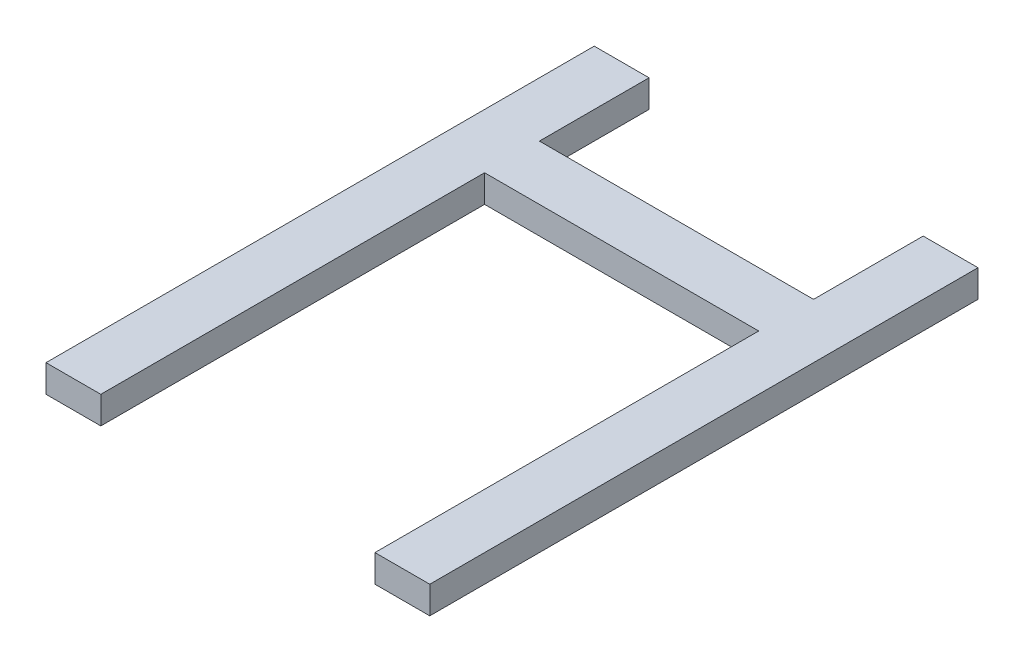
ISO-10303-21;
HEADER;
FILE_DESCRIPTION(('STEP AP214'),'2;1');
FILE_NAME('part.step','',(''),(''),'','','');
FILE_SCHEMA(('AUTOMOTIVE_DESIGN { 1 0 10303 214 1 1 1 1 }'));
ENDSEC;
DATA;
#1=APPLICATION_CONTEXT('core data for automotive mechanical design processes');
#2=APPLICATION_PROTOCOL_DEFINITION('international standard','automotive_design',2000,#1);
#3=PRODUCT_CONTEXT('',#1,'mechanical');
#4=PRODUCT('Part','Part','',(#3));
#5=PRODUCT_RELATED_PRODUCT_CATEGORY('part','',(#4));
#6=PRODUCT_DEFINITION_FORMATION('','',#4);
#7=PRODUCT_DEFINITION_CONTEXT('part definition',#1,'design');
#8=PRODUCT_DEFINITION('design','',#6,#7);
#9=PRODUCT_DEFINITION_SHAPE('','',#8);
#10=(LENGTH_UNIT() NAMED_UNIT(*) SI_UNIT(.MILLI.,.METRE.));
#11=(NAMED_UNIT(*) PLANE_ANGLE_UNIT() SI_UNIT($,.RADIAN.));
#12=(NAMED_UNIT(*) SI_UNIT($,.STERADIAN.) SOLID_ANGLE_UNIT());
#13=UNCERTAINTY_MEASURE_WITH_UNIT(LENGTH_MEASURE(1.E-05),#10,'distance_accuracy_value','');
#14=(GEOMETRIC_REPRESENTATION_CONTEXT(3) GLOBAL_UNCERTAINTY_ASSIGNED_CONTEXT((#13)) GLOBAL_UNIT_ASSIGNED_CONTEXT((#10,
#11,#12)) REPRESENTATION_CONTEXT('',''));
#15=CARTESIAN_POINT('',(0.,0.,0.));
#16=DIRECTION('',(0.,0.,1.));
#17=DIRECTION('',(1.,0.,0.));
#18=AXIS2_PLACEMENT_3D('',#15,#16,#17);
#19=CARTESIAN_POINT('',(-25.,5.,0.));
#20=DIRECTION('',(1.,0.,0.));
#21=DIRECTION('',(0.,0.,-1.));
#22=AXIS2_PLACEMENT_3D('',#19,#20,#21);
#23=PLANE('',#22);
#24=DIRECTION('',(0.,0.,1.));
#25=VECTOR('',#24,1.);
#26=CARTESIAN_POINT('',(-25.,0.,0.));
#27=LINE('',#26,#25);
#28=CARTESIAN_POINT('',(-25.,0.,-25.));
#29=VERTEX_POINT('',#28);
#30=CARTESIAN_POINT('',(-25.,0.,-5.));
#31=VERTEX_POINT('',#30);
#32=EDGE_CURVE('E161',#29,#31,#27,.T.);
#33=ORIENTED_EDGE('',*,*,#32,.F.);
#34=DIRECTION('',(0.,-1.,0.));
#35=VECTOR('',#34,1.);
#36=CARTESIAN_POINT('',(-25.,5.,-25.));
#37=LINE('',#36,#35);
#38=CARTESIAN_POINT('',(-25.,5.,-25.));
#39=VERTEX_POINT('',#38);
#40=EDGE_CURVE('E11',#39,#29,#37,.T.);
#41=ORIENTED_EDGE('',*,*,#40,.F.);
#42=DIRECTION('',(0.,0.,1.));
#43=VECTOR('',#42,1.);
#44=CARTESIAN_POINT('',(-25.,5.,0.));
#45=LINE('',#44,#43);
#46=CARTESIAN_POINT('',(-25.,5.,-5.));
#47=VERTEX_POINT('',#46);
#48=EDGE_CURVE('E187',#39,#47,#45,.T.);
#49=ORIENTED_EDGE('',*,*,#48,.T.);
#50=DIRECTION('',(0.,-1.,0.));
#51=VECTOR('',#50,1.);
#52=CARTESIAN_POINT('',(-25.,5.,-5.));
#53=LINE('',#52,#51);
#54=EDGE_CURVE('E58',#47,#31,#53,.T.);
#55=ORIENTED_EDGE('',*,*,#54,.T.);
#56=EDGE_LOOP('',(#33,#41,#49,#55));
#57=FACE_BOUND('',#56,.T.);
#58=ADVANCED_FACE('F41',(#57),#23,.T.);
#59=CARTESIAN_POINT('',(0.,5.,-25.));
#60=DIRECTION('',(0.,0.,-1.));
#61=DIRECTION('',(-1.,0.,0.));
#62=AXIS2_PLACEMENT_3D('',#59,#60,#61);
#63=PLANE('',#62);
#64=DIRECTION('',(1.,0.,0.));
#65=VECTOR('',#64,1.);
#66=CARTESIAN_POINT('',(0.,0.,-25.));
#67=LINE('',#66,#65);
#68=CARTESIAN_POINT('',(-35.,0.,-25.));
#69=VERTEX_POINT('',#68);
#70=EDGE_CURVE('E163',#69,#29,#67,.T.);
#71=ORIENTED_EDGE('',*,*,#70,.F.);
#72=DIRECTION('',(0.,-1.,0.));
#73=VECTOR('',#72,1.);
#74=CARTESIAN_POINT('',(-35.,5.,-25.));
#75=LINE('',#74,#73);
#76=CARTESIAN_POINT('',(-35.,5.,-25.));
#77=VERTEX_POINT('',#76);
#78=EDGE_CURVE('E50',#77,#69,#75,.T.);
#79=ORIENTED_EDGE('',*,*,#78,.F.);
#80=DIRECTION('',(1.,0.,0.));
#81=VECTOR('',#80,1.);
#82=CARTESIAN_POINT('',(0.,5.,-25.));
#83=LINE('',#82,#81);
#84=EDGE_CURVE('E219',#77,#39,#83,.T.);
#85=ORIENTED_EDGE('',*,*,#84,.T.);
#86=ORIENTED_EDGE('',*,*,#40,.T.);
#87=EDGE_LOOP('',(#71,#79,#85,#86));
#88=FACE_BOUND('',#87,.T.);
#89=ADVANCED_FACE('F43',(#88),#63,.T.);
#90=CARTESIAN_POINT('',(-35.,5.,0.));
#91=DIRECTION('',(1.,0.,0.));
#92=DIRECTION('',(0.,0.,-1.));
#93=AXIS2_PLACEMENT_3D('',#90,#91,#92);
#94=PLANE('',#93);
#95=DIRECTION('',(0.,0.,1.));
#96=VECTOR('',#95,1.);
#97=CARTESIAN_POINT('',(-35.,0.,0.));
#98=LINE('',#97,#96);
#99=CARTESIAN_POINT('',(-35.,0.,75.));
#100=VERTEX_POINT('',#99);
#101=EDGE_CURVE('E167',#69,#100,#98,.T.);
#102=ORIENTED_EDGE('',*,*,#101,.T.);
#103=DIRECTION('',(0.,-1.,0.));
#104=VECTOR('',#103,1.);
#105=CARTESIAN_POINT('',(-35.,5.,75.));
#106=LINE('',#105,#104);
#107=CARTESIAN_POINT('',(-35.,5.,75.));
#108=VERTEX_POINT('',#107);
#109=EDGE_CURVE('E203',#108,#100,#106,.T.);
#110=ORIENTED_EDGE('',*,*,#109,.F.);
#111=DIRECTION('',(0.,0.,1.));
#112=VECTOR('',#111,1.);
#113=CARTESIAN_POINT('',(-35.,5.,0.));
#114=LINE('',#113,#112);
#115=EDGE_CURVE('E210',#77,#108,#114,.T.);
#116=ORIENTED_EDGE('',*,*,#115,.F.);
#117=ORIENTED_EDGE('',*,*,#78,.T.);
#118=EDGE_LOOP('',(#102,#110,#116,#117));
#119=FACE_BOUND('',#118,.T.);
#120=ADVANCED_FACE('F208',(#119),#94,.F.);
#121=CARTESIAN_POINT('',(0.,5.,75.));
#122=DIRECTION('',(0.,0.,-1.));
#123=DIRECTION('',(-1.,0.,0.));
#124=AXIS2_PLACEMENT_3D('',#121,#122,#123);
#125=PLANE('',#124);
#126=DIRECTION('',(1.,0.,0.));
#127=VECTOR('',#126,1.);
#128=CARTESIAN_POINT('',(0.,0.,75.));
#129=LINE('',#128,#127);
#130=CARTESIAN_POINT('',(-25.,0.,75.));
#131=VERTEX_POINT('',#130);
#132=EDGE_CURVE('E169',#100,#131,#129,.T.);
#133=ORIENTED_EDGE('',*,*,#132,.T.);
#134=DIRECTION('',(0.,-1.,0.));
#135=VECTOR('',#134,1.);
#136=CARTESIAN_POINT('',(-25.,5.,75.));
#137=LINE('',#136,#135);
#138=CARTESIAN_POINT('',(-25.,5.,75.));
#139=VERTEX_POINT('',#138);
#140=EDGE_CURVE('E201',#139,#131,#137,.T.);
#141=ORIENTED_EDGE('',*,*,#140,.F.);
#142=DIRECTION('',(1.,0.,0.));
#143=VECTOR('',#142,1.);
#144=CARTESIAN_POINT('',(0.,5.,75.));
#145=LINE('',#144,#143);
#146=EDGE_CURVE('E265',#108,#139,#145,.T.);
#147=ORIENTED_EDGE('',*,*,#146,.F.);
#148=ORIENTED_EDGE('',*,*,#109,.T.);
#149=EDGE_LOOP('',(#133,#141,#147,#148));
#150=FACE_BOUND('',#149,.T.);
#151=ADVANCED_FACE('F241',(#150),#125,.F.);
#152=CARTESIAN_POINT('',(-25.,0.,5.));
#153=VERTEX_POINT('',#152);
#154=EDGE_CURVE('E164',#153,#131,#27,.T.);
#155=ORIENTED_EDGE('',*,*,#154,.F.);
#156=DIRECTION('',(0.,-1.,0.));
#157=VECTOR('',#156,1.);
#158=CARTESIAN_POINT('',(-25.,5.,5.));
#159=LINE('',#158,#157);
#160=CARTESIAN_POINT('',(-25.,5.,5.));
#161=VERTEX_POINT('',#160);
#162=EDGE_CURVE('E199',#161,#153,#159,.T.);
#163=ORIENTED_EDGE('',*,*,#162,.F.);
#164=EDGE_CURVE('E262',#161,#139,#45,.T.);
#165=ORIENTED_EDGE('',*,*,#164,.T.);
#166=ORIENTED_EDGE('',*,*,#140,.T.);
#167=EDGE_LOOP('',(#155,#163,#165,#166));
#168=FACE_BOUND('',#167,.T.);
#169=ADVANCED_FACE('F233',(#168),#23,.T.);
#170=CARTESIAN_POINT('',(0.,5.,5.));
#171=DIRECTION('',(0.,0.,-1.));
#172=DIRECTION('',(-1.,0.,0.));
#173=AXIS2_PLACEMENT_3D('',#170,#171,#172);
#174=PLANE('',#173);
#175=DIRECTION('',(1.,0.,0.));
#176=VECTOR('',#175,1.);
#177=CARTESIAN_POINT('',(0.,0.,5.));
#178=LINE('',#177,#176);
#179=CARTESIAN_POINT('',(25.,0.,5.));
#180=VERTEX_POINT('',#179);
#181=EDGE_CURVE('E172',#153,#180,#178,.T.);
#182=ORIENTED_EDGE('',*,*,#181,.T.);
#183=DIRECTION('',(0.,-1.,0.));
#184=VECTOR('',#183,1.);
#185=CARTESIAN_POINT('',(25.,5.,5.));
#186=LINE('',#185,#184);
#187=CARTESIAN_POINT('',(25.,5.,5.));
#188=VERTEX_POINT('',#187);
#189=EDGE_CURVE('E196',#188,#180,#186,.T.);
#190=ORIENTED_EDGE('',*,*,#189,.F.);
#191=DIRECTION('',(1.,0.,0.));
#192=VECTOR('',#191,1.);
#193=CARTESIAN_POINT('',(0.,5.,5.));
#194=LINE('',#193,#192);
#195=EDGE_CURVE('E261',#161,#188,#194,.T.);
#196=ORIENTED_EDGE('',*,*,#195,.F.);
#197=ORIENTED_EDGE('',*,*,#162,.T.);
#198=EDGE_LOOP('',(#182,#190,#196,#197));
#199=FACE_BOUND('',#198,.T.);
#200=ADVANCED_FACE('F240',(#199),#174,.F.);
#201=CARTESIAN_POINT('',(25.,5.,0.));
#202=DIRECTION('',(1.,0.,0.));
#203=DIRECTION('',(0.,0.,-1.));
#204=AXIS2_PLACEMENT_3D('',#201,#202,#203);
#205=PLANE('',#204);
#206=DIRECTION('',(0.,0.,1.));
#207=VECTOR('',#206,1.);
#208=CARTESIAN_POINT('',(25.,0.,0.));
#209=LINE('',#208,#207);
#210=CARTESIAN_POINT('',(25.,0.,75.));
#211=VERTEX_POINT('',#210);
#212=EDGE_CURVE('E174',#180,#211,#209,.T.);
#213=ORIENTED_EDGE('',*,*,#212,.T.);
#214=DIRECTION('',(0.,-1.,0.));
#215=VECTOR('',#214,1.);
#216=CARTESIAN_POINT('',(25.,5.,75.));
#217=LINE('',#216,#215);
#218=CARTESIAN_POINT('',(25.,5.,75.));
#219=VERTEX_POINT('',#218);
#220=EDGE_CURVE('E193',#219,#211,#217,.T.);
#221=ORIENTED_EDGE('',*,*,#220,.F.);
#222=DIRECTION('',(0.,0.,1.));
#223=VECTOR('',#222,1.);
#224=CARTESIAN_POINT('',(25.,5.,0.));
#225=LINE('',#224,#223);
#226=EDGE_CURVE('E150',#188,#219,#225,.T.);
#227=ORIENTED_EDGE('',*,*,#226,.F.);
#228=ORIENTED_EDGE('',*,*,#189,.T.);
#229=EDGE_LOOP('',(#213,#221,#227,#228));
#230=FACE_BOUND('',#229,.T.);
#231=ADVANCED_FACE('F229',(#230),#205,.F.);
#232=CARTESIAN_POINT('',(0.,5.,75.));
#233=DIRECTION('',(0.,0.,-1.));
#234=DIRECTION('',(-1.,0.,0.));
#235=AXIS2_PLACEMENT_3D('',#232,#233,#234);
#236=PLANE('',#235);
#237=DIRECTION('',(1.,0.,0.));
#238=VECTOR('',#237,1.);
#239=CARTESIAN_POINT('',(0.,0.,75.));
#240=LINE('',#239,#238);
#241=CARTESIAN_POINT('',(35.,0.,75.));
#242=VERTEX_POINT('',#241);
#243=EDGE_CURVE('E176',#211,#242,#240,.T.);
#244=ORIENTED_EDGE('',*,*,#243,.T.);
#245=DIRECTION('',(0.,-1.,0.));
#246=VECTOR('',#245,1.);
#247=CARTESIAN_POINT('',(35.,5.,75.));
#248=LINE('',#247,#246);
#249=CARTESIAN_POINT('',(35.,5.,75.));
#250=VERTEX_POINT('',#249);
#251=EDGE_CURVE('E191',#250,#242,#248,.T.);
#252=ORIENTED_EDGE('',*,*,#251,.F.);
#253=DIRECTION('',(1.,0.,0.));
#254=VECTOR('',#253,1.);
#255=CARTESIAN_POINT('',(0.,5.,75.));
#256=LINE('',#255,#254);
#257=EDGE_CURVE('E156',#219,#250,#256,.T.);
#258=ORIENTED_EDGE('',*,*,#257,.F.);
#259=ORIENTED_EDGE('',*,*,#220,.T.);
#260=EDGE_LOOP('',(#244,#252,#258,#259));
#261=FACE_BOUND('',#260,.T.);
#262=ADVANCED_FACE('F273',(#261),#236,.F.);
#263=CARTESIAN_POINT('',(35.,5.,0.));
#264=DIRECTION('',(1.,0.,0.));
#265=DIRECTION('',(0.,0.,-1.));
#266=AXIS2_PLACEMENT_3D('',#263,#264,#265);
#267=PLANE('',#266);
#268=DIRECTION('',(0.,0.,1.));
#269=VECTOR('',#268,1.);
#270=CARTESIAN_POINT('',(35.,0.,0.));
#271=LINE('',#270,#269);
#272=CARTESIAN_POINT('',(35.,0.,-25.));
#273=VERTEX_POINT('',#272);
#274=EDGE_CURVE('E180',#273,#242,#271,.T.);
#275=ORIENTED_EDGE('',*,*,#274,.F.);
#276=DIRECTION('',(0.,-1.,0.));
#277=VECTOR('',#276,1.);
#278=CARTESIAN_POINT('',(35.,5.,-25.));
#279=LINE('',#278,#277);
#280=CARTESIAN_POINT('',(35.,5.,-25.));
#281=VERTEX_POINT('',#280);
#282=EDGE_CURVE('E142',#281,#273,#279,.T.);
#283=ORIENTED_EDGE('',*,*,#282,.F.);
#284=DIRECTION('',(0.,0.,1.));
#285=VECTOR('',#284,1.);
#286=CARTESIAN_POINT('',(35.,5.,0.));
#287=LINE('',#286,#285);
#288=EDGE_CURVE('E154',#281,#250,#287,.T.);
#289=ORIENTED_EDGE('',*,*,#288,.T.);
#290=ORIENTED_EDGE('',*,*,#251,.T.);
#291=EDGE_LOOP('',(#275,#283,#289,#290));
#292=FACE_BOUND('',#291,.T.);
#293=ADVANCED_FACE('F276',(#292),#267,.T.);
#294=CARTESIAN_POINT('',(0.,5.,-25.));
#295=DIRECTION('',(0.,0.,-1.));
#296=DIRECTION('',(-1.,0.,0.));
#297=AXIS2_PLACEMENT_3D('',#294,#295,#296);
#298=PLANE('',#297);
#299=DIRECTION('',(1.,0.,0.));
#300=VECTOR('',#299,1.);
#301=CARTESIAN_POINT('',(0.,0.,-25.));
#302=LINE('',#301,#300);
#303=CARTESIAN_POINT('',(25.,0.,-25.));
#304=VERTEX_POINT('',#303);
#305=EDGE_CURVE('E139',#304,#273,#302,.T.);
#306=ORIENTED_EDGE('',*,*,#305,.F.);
#307=DIRECTION('',(0.,-1.,0.));
#308=VECTOR('',#307,1.);
#309=CARTESIAN_POINT('',(25.,5.,-25.));
#310=LINE('',#309,#308);
#311=CARTESIAN_POINT('',(25.,5.,-25.));
#312=VERTEX_POINT('',#311);
#313=EDGE_CURVE('E133',#312,#304,#310,.T.);
#314=ORIENTED_EDGE('',*,*,#313,.F.);
#315=DIRECTION('',(1.,0.,0.));
#316=VECTOR('',#315,1.);
#317=CARTESIAN_POINT('',(0.,5.,-25.));
#318=LINE('',#317,#316);
#319=EDGE_CURVE('E137',#312,#281,#318,.T.);
#320=ORIENTED_EDGE('',*,*,#319,.T.);
#321=ORIENTED_EDGE('',*,*,#282,.T.);
#322=EDGE_LOOP('',(#306,#314,#320,#321));
#323=FACE_BOUND('',#322,.T.);
#324=ADVANCED_FACE('F135',(#323),#298,.T.);
#325=CARTESIAN_POINT('',(25.,0.,-5.));
#326=VERTEX_POINT('',#325);
#327=EDGE_CURVE('E177',#304,#326,#209,.T.);
#328=ORIENTED_EDGE('',*,*,#327,.T.);
#329=DIRECTION('',(0.,-1.,0.));
#330=VECTOR('',#329,1.);
#331=CARTESIAN_POINT('',(25.,5.,-5.));
#332=LINE('',#331,#330);
#333=CARTESIAN_POINT('',(25.,5.,-5.));
#334=VERTEX_POINT('',#333);
#335=EDGE_CURVE('E96',#334,#326,#332,.T.);
#336=ORIENTED_EDGE('',*,*,#335,.F.);
#337=EDGE_CURVE('E144',#312,#334,#225,.T.);
#338=ORIENTED_EDGE('',*,*,#337,.F.);
#339=ORIENTED_EDGE('',*,*,#313,.T.);
#340=EDGE_LOOP('',(#328,#336,#338,#339));
#341=FACE_BOUND('',#340,.T.);
#342=ADVANCED_FACE('F145',(#341),#205,.F.);
#343=CARTESIAN_POINT('',(0.,5.,-5.));
#344=DIRECTION('',(0.,0.,-1.));
#345=DIRECTION('',(-1.,0.,0.));
#346=AXIS2_PLACEMENT_3D('',#343,#344,#345);
#347=PLANE('',#346);
#348=DIRECTION('',(1.,0.,0.));
#349=VECTOR('',#348,1.);
#350=CARTESIAN_POINT('',(0.,0.,-5.));
#351=LINE('',#350,#349);
#352=EDGE_CURVE('E184',#31,#326,#351,.T.);
#353=ORIENTED_EDGE('',*,*,#352,.F.);
#354=ORIENTED_EDGE('',*,*,#54,.F.);
#355=DIRECTION('',(1.,0.,0.));
#356=VECTOR('',#355,1.);
#357=CARTESIAN_POINT('',(0.,5.,-5.));
#358=LINE('',#357,#356);
#359=EDGE_CURVE('E148',#47,#334,#358,.T.);
#360=ORIENTED_EDGE('',*,*,#359,.T.);
#361=ORIENTED_EDGE('',*,*,#335,.T.);
#362=EDGE_LOOP('',(#353,#354,#360,#361));
#363=FACE_BOUND('',#362,.T.);
#364=ADVANCED_FACE('F220',(#363),#347,.T.);
#365=CARTESIAN_POINT('',(0.,5.,0.));
#366=DIRECTION('',(0.,1.,0.));
#367=DIRECTION('',(0.,0.,1.));
#368=AXIS2_PLACEMENT_3D('',#365,#366,#367);
#369=PLANE('',#368);
#370=ORIENTED_EDGE('',*,*,#48,.F.);
#371=ORIENTED_EDGE('',*,*,#84,.F.);
#372=ORIENTED_EDGE('',*,*,#115,.T.);
#373=ORIENTED_EDGE('',*,*,#146,.T.);
#374=ORIENTED_EDGE('',*,*,#164,.F.);
#375=ORIENTED_EDGE('',*,*,#195,.T.);
#376=ORIENTED_EDGE('',*,*,#226,.T.);
#377=ORIENTED_EDGE('',*,*,#257,.T.);
#378=ORIENTED_EDGE('',*,*,#288,.F.);
#379=ORIENTED_EDGE('',*,*,#319,.F.);
#380=ORIENTED_EDGE('',*,*,#337,.T.);
#381=ORIENTED_EDGE('',*,*,#359,.F.);
#382=EDGE_LOOP('',(#370,#371,#372,#373,#374,#375,#376,#377,#378,#379,#380,#381));
#383=FACE_BOUND('',#382,.T.);
#384=ADVANCED_FACE('F152',(#383),#369,.T.);
#385=CARTESIAN_POINT('',(0.,0.,0.));
#386=DIRECTION('',(0.,1.,0.));
#387=DIRECTION('',(0.,0.,1.));
#388=AXIS2_PLACEMENT_3D('',#385,#386,#387);
#389=PLANE('',#388);
#390=ORIENTED_EDGE('',*,*,#32,.T.);
#391=ORIENTED_EDGE('',*,*,#352,.T.);
#392=ORIENTED_EDGE('',*,*,#327,.F.);
#393=ORIENTED_EDGE('',*,*,#305,.T.);
#394=ORIENTED_EDGE('',*,*,#274,.T.);
#395=ORIENTED_EDGE('',*,*,#243,.F.);
#396=ORIENTED_EDGE('',*,*,#212,.F.);
#397=ORIENTED_EDGE('',*,*,#181,.F.);
#398=ORIENTED_EDGE('',*,*,#154,.T.);
#399=ORIENTED_EDGE('',*,*,#132,.F.);
#400=ORIENTED_EDGE('',*,*,#101,.F.);
#401=ORIENTED_EDGE('',*,*,#70,.T.);
#402=EDGE_LOOP('',(#390,#391,#392,#393,#394,#395,#396,#397,#398,#399,#400,#401));
#403=FACE_BOUND('',#402,.T.);
#404=ADVANCED_FACE('F217',(#403),#389,.F.);
#405=CLOSED_SHELL('',(#58,#89,#120,#151,#169,#200,#231,#262,#293,#324,#342,#364,#384,#404));
#406=MANIFOLD_SOLID_BREP('B2',#405);
#407=ADVANCED_BREP_SHAPE_REPRESENTATION('',(#18,#406),#14);
#408=SHAPE_DEFINITION_REPRESENTATION(#9,#407);
ENDSEC;
END-ISO-10303-21;
